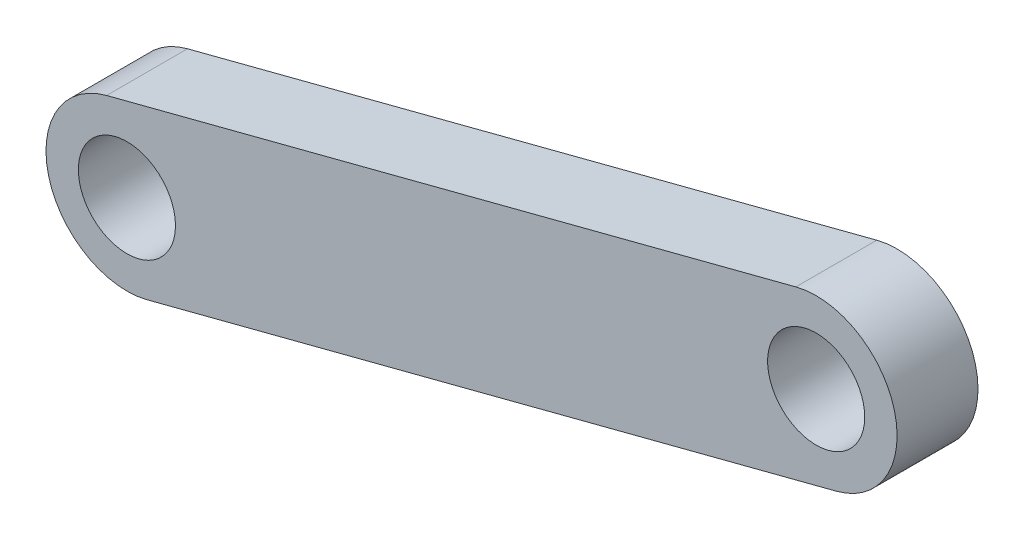
ISO-10303-21;
HEADER;
FILE_DESCRIPTION(('STEP AP214'),'2;1');
FILE_NAME('part.step','',(''),(''),'','','');
FILE_SCHEMA(('AUTOMOTIVE_DESIGN { 1 0 10303 214 1 1 1 1 }'));
ENDSEC;
DATA;
#1=APPLICATION_CONTEXT('core data for automotive mechanical design processes');
#2=APPLICATION_PROTOCOL_DEFINITION('international standard','automotive_design',2000,#1);
#3=PRODUCT_CONTEXT('',#1,'mechanical');
#4=PRODUCT('Part','Part','',(#3));
#5=PRODUCT_RELATED_PRODUCT_CATEGORY('part','',(#4));
#6=PRODUCT_DEFINITION_FORMATION('','',#4);
#7=PRODUCT_DEFINITION_CONTEXT('part definition',#1,'design');
#8=PRODUCT_DEFINITION('design','',#6,#7);
#9=PRODUCT_DEFINITION_SHAPE('','',#8);
#10=(LENGTH_UNIT() NAMED_UNIT(*) SI_UNIT(.MILLI.,.METRE.));
#11=(NAMED_UNIT(*) PLANE_ANGLE_UNIT() SI_UNIT($,.RADIAN.));
#12=(NAMED_UNIT(*) SI_UNIT($,.STERADIAN.) SOLID_ANGLE_UNIT());
#13=UNCERTAINTY_MEASURE_WITH_UNIT(LENGTH_MEASURE(1.E-05),#10,'distance_accuracy_value','');
#14=(GEOMETRIC_REPRESENTATION_CONTEXT(3) GLOBAL_UNCERTAINTY_ASSIGNED_CONTEXT((#13)) GLOBAL_UNIT_ASSIGNED_CONTEXT((#10,
#11,#12)) REPRESENTATION_CONTEXT('',''));
#15=CARTESIAN_POINT('',(0.,0.,0.));
#16=DIRECTION('',(0.,0.,1.));
#17=DIRECTION('',(1.,0.,0.));
#18=AXIS2_PLACEMENT_3D('',#15,#16,#17);
#19=CARTESIAN_POINT('',(-4.11150948786102,15.8443971540323,2.5));
#20=DIRECTION('',(0.251174112768107,-0.967941922366809,0.));
#21=DIRECTION('',(0.967941922366809,0.251174112768107,0.));
#22=AXIS2_PLACEMENT_3D('',#19,#20,#21);
#23=PLANE('',#22);
#24=DIRECTION('',(-0.967941922366809,-0.251174112768107,0.));
#25=VECTOR('',#24,1.);
#26=CARTESIAN_POINT('',(-4.11150948786102,15.8443971540323,0.));
#27=LINE('',#26,#25);
#28=CARTESIAN_POINT('',(-170.179736797107,-27.2491384078721,0.));
#29=VERTEX_POINT('',#28);
#30=CARTESIAN_POINT('',(-191.474459089177,-32.7749688887705,0.));
#31=VERTEX_POINT('',#30);
#32=EDGE_CURVE('E108',#29,#31,#27,.T.);
#33=ORIENTED_EDGE('',*,*,#32,.T.);
#34=DIRECTION('',(0.,0.,-1.));
#35=VECTOR('',#34,1.);
#36=CARTESIAN_POINT('',(-191.474459089177,-32.7749688887705,2.5));
#37=LINE('',#36,#35);
#38=CARTESIAN_POINT('',(-191.474459089177,-32.7749688887705,2.5));
#39=VERTEX_POINT('',#38);
#40=EDGE_CURVE('E11',#39,#31,#37,.T.);
#41=ORIENTED_EDGE('',*,*,#40,.F.);
#42=DIRECTION('',(-0.967941922366809,-0.251174112768107,0.));
#43=VECTOR('',#42,1.);
#44=CARTESIAN_POINT('',(-4.11150948786102,15.8443971540323,2.5));
#45=LINE('',#44,#43);
#46=CARTESIAN_POINT('',(-170.179736797107,-27.2491384078721,2.5));
#47=VERTEX_POINT('',#46);
#48=EDGE_CURVE('E90',#47,#39,#45,.T.);
#49=ORIENTED_EDGE('',*,*,#48,.F.);
#50=DIRECTION('',(0.,0.,-1.));
#51=VECTOR('',#50,1.);
#52=CARTESIAN_POINT('',(-170.179736797107,-27.2491384078721,2.5));
#53=LINE('',#52,#51);
#54=EDGE_CURVE('E104',#47,#29,#53,.T.);
#55=ORIENTED_EDGE('',*,*,#54,.T.);
#56=EDGE_LOOP('',(#33,#41,#49,#55));
#57=FACE_BOUND('',#56,.T.);
#58=ADVANCED_FACE('F37',(#57),#23,.F.);
#59=CARTESIAN_POINT('',(-190.846523807257,-35.1948236946875,2.5));
#60=DIRECTION('',(0.,0.,-1.));
#61=DIRECTION('',(-1.,0.,0.));
#62=AXIS2_PLACEMENT_3D('',#59,#60,#61);
#63=CYLINDRICAL_SURFACE('',#62,2.5);
#64=CARTESIAN_POINT('',(-190.846523807257,-35.1948236946875,0.));
#65=DIRECTION('',(0.,0.,1.));
#66=DIRECTION('',(1.,0.,0.));
#67=AXIS2_PLACEMENT_3D('',#64,#65,#66);
#68=CIRCLE('',#67,2.5);
#69=CARTESIAN_POINT('',(-190.218588525336,-37.6146785006045,0.));
#70=VERTEX_POINT('',#69);
#71=EDGE_CURVE('E94',#31,#70,#68,.T.);
#72=ORIENTED_EDGE('',*,*,#71,.T.);
#73=DIRECTION('',(0.,0.,-1.));
#74=VECTOR('',#73,1.);
#75=CARTESIAN_POINT('',(-190.218588525336,-37.6146785006045,2.5));
#76=LINE('',#75,#74);
#77=CARTESIAN_POINT('',(-190.218588525336,-37.6146785006045,2.5));
#78=VERTEX_POINT('',#77);
#79=EDGE_CURVE('E46',#78,#70,#76,.T.);
#80=ORIENTED_EDGE('',*,*,#79,.F.);
#81=CARTESIAN_POINT('',(-190.846523807257,-35.1948236946875,2.5));
#82=DIRECTION('',(0.,0.,1.));
#83=DIRECTION('',(1.,0.,0.));
#84=AXIS2_PLACEMENT_3D('',#81,#82,#83);
#85=CIRCLE('',#84,2.5);
#86=EDGE_CURVE('E84',#39,#78,#85,.T.);
#87=ORIENTED_EDGE('',*,*,#86,.F.);
#88=ORIENTED_EDGE('',*,*,#40,.T.);
#89=EDGE_LOOP('',(#72,#80,#87,#88));
#90=FACE_BOUND('',#89,.T.);
#91=ADVANCED_FACE('F93',(#90),#63,.T.);
#92=CARTESIAN_POINT('',(-2.85563892401987,11.0046875421963,2.5));
#93=DIRECTION('',(-0.251174112768097,0.967941922366812,0.));
#94=DIRECTION('',(-0.967941922366812,-0.251174112768097,0.));
#95=AXIS2_PLACEMENT_3D('',#92,#93,#94);
#96=PLANE('',#95);
#97=DIRECTION('',(0.967941922366812,0.251174112768097,0.));
#98=VECTOR('',#97,1.);
#99=CARTESIAN_POINT('',(-2.85563892401987,11.0046875421963,0.));
#100=LINE('',#99,#98);
#101=CARTESIAN_POINT('',(-168.923866233267,-32.0888480197064,0.));
#102=VERTEX_POINT('',#101);
#103=EDGE_CURVE('E71',#70,#102,#100,.T.);
#104=ORIENTED_EDGE('',*,*,#103,.T.);
#105=DIRECTION('',(0.,0.,-1.));
#106=VECTOR('',#105,1.);
#107=CARTESIAN_POINT('',(-168.923866233267,-32.0888480197064,2.5));
#108=LINE('',#107,#106);
#109=CARTESIAN_POINT('',(-168.923866233267,-32.0888480197064,2.5));
#110=VERTEX_POINT('',#109);
#111=EDGE_CURVE('E95',#110,#102,#108,.T.);
#112=ORIENTED_EDGE('',*,*,#111,.F.);
#113=DIRECTION('',(0.967941922366812,0.251174112768097,0.));
#114=VECTOR('',#113,1.);
#115=CARTESIAN_POINT('',(-2.85563892401987,11.0046875421963,2.5));
#116=LINE('',#115,#114);
#117=EDGE_CURVE('E88',#78,#110,#116,.T.);
#118=ORIENTED_EDGE('',*,*,#117,.F.);
#119=ORIENTED_EDGE('',*,*,#79,.T.);
#120=EDGE_LOOP('',(#104,#112,#118,#119));
#121=FACE_BOUND('',#120,.T.);
#122=ADVANCED_FACE('F96',(#121),#96,.F.);
#123=CARTESIAN_POINT('',(-169.551801515187,-29.6689932137893,2.5));
#124=DIRECTION('',(0.,0.,-1.));
#125=DIRECTION('',(-1.,0.,0.));
#126=AXIS2_PLACEMENT_3D('',#123,#124,#125);
#127=CYLINDRICAL_SURFACE('',#126,2.50000000000011);
#128=CARTESIAN_POINT('',(-169.551801515187,-29.6689932137893,0.));
#129=DIRECTION('',(0.,0.,1.));
#130=DIRECTION('',(1.,0.,0.));
#131=AXIS2_PLACEMENT_3D('',#128,#129,#130);
#132=CIRCLE('',#131,2.50000000000011);
#133=EDGE_CURVE('E77',#102,#29,#132,.T.);
#134=ORIENTED_EDGE('',*,*,#133,.T.);
#135=ORIENTED_EDGE('',*,*,#54,.F.);
#136=CARTESIAN_POINT('',(-169.551801515187,-29.6689932137893,2.5));
#137=DIRECTION('',(0.,0.,1.));
#138=DIRECTION('',(1.,0.,0.));
#139=AXIS2_PLACEMENT_3D('',#136,#137,#138);
#140=CIRCLE('',#139,2.50000000000011);
#141=EDGE_CURVE('E54',#110,#47,#140,.T.);
#142=ORIENTED_EDGE('',*,*,#141,.F.);
#143=ORIENTED_EDGE('',*,*,#111,.T.);
#144=EDGE_LOOP('',(#134,#135,#142,#143));
#145=FACE_BOUND('',#144,.T.);
#146=ADVANCED_FACE('F119',(#145),#127,.T.);
#147=CARTESIAN_POINT('',(-190.846523807257,-35.1948236946875,2.5));
#148=DIRECTION('',(0.,0.,-1.));
#149=DIRECTION('',(-1.,0.,0.));
#150=AXIS2_PLACEMENT_3D('',#147,#148,#149);
#151=CYLINDRICAL_SURFACE('',#150,1.50000000000003);
#152=CARTESIAN_POINT('',(-190.846523807257,-35.1948236946875,2.5));
#153=DIRECTION('',(0.,0.,1.));
#154=DIRECTION('',(1.,0.,0.));
#155=AXIS2_PLACEMENT_3D('',#152,#153,#154);
#156=CIRCLE('',#155,1.50000000000003);
#157=CARTESIAN_POINT('',(-189.346523807257,-35.1948236946875,2.5));
#158=VERTEX_POINT('',#157);
#159=EDGE_CURVE('E117',#158,#158,#156,.T.);
#160=ORIENTED_EDGE('',*,*,#159,.T.);
#161=EDGE_LOOP('',(#160));
#162=FACE_BOUND('',#161,.T.);
#163=CARTESIAN_POINT('',(-190.846523807257,-35.1948236946875,0.));
#164=DIRECTION('',(0.,0.,1.));
#165=DIRECTION('',(1.,0.,0.));
#166=AXIS2_PLACEMENT_3D('',#163,#164,#165);
#167=CIRCLE('',#166,1.50000000000003);
#168=CARTESIAN_POINT('',(-189.346523807257,-35.1948236946875,0.));
#169=VERTEX_POINT('',#168);
#170=EDGE_CURVE('E105',#169,#169,#167,.T.);
#171=ORIENTED_EDGE('',*,*,#170,.F.);
#172=EDGE_LOOP('',(#171));
#173=FACE_BOUND('',#172,.T.);
#174=ADVANCED_FACE('F39',(#162,#173),#151,.F.);
#175=CARTESIAN_POINT('',(-169.551801515187,-29.6689932137893,2.5));
#176=DIRECTION('',(0.,0.,-1.));
#177=DIRECTION('',(-1.,0.,0.));
#178=AXIS2_PLACEMENT_3D('',#175,#176,#177);
#179=CYLINDRICAL_SURFACE('',#178,1.50001780392866);
#180=CARTESIAN_POINT('',(-169.551801515187,-29.6689932137893,2.5));
#181=DIRECTION('',(0.,0.,1.));
#182=DIRECTION('',(1.,0.,0.));
#183=AXIS2_PLACEMENT_3D('',#180,#181,#182);
#184=CIRCLE('',#183,1.50001780392866);
#185=CARTESIAN_POINT('',(-168.051783711258,-29.6689932137893,2.5));
#186=VERTEX_POINT('',#185);
#187=EDGE_CURVE('E98',#186,#186,#184,.T.);
#188=ORIENTED_EDGE('',*,*,#187,.T.);
#189=EDGE_LOOP('',(#188));
#190=FACE_BOUND('',#189,.T.);
#191=CARTESIAN_POINT('',(-169.551801515187,-29.6689932137893,0.));
#192=DIRECTION('',(0.,0.,1.));
#193=DIRECTION('',(1.,0.,0.));
#194=AXIS2_PLACEMENT_3D('',#191,#192,#193);
#195=CIRCLE('',#194,1.50001780392866);
#196=CARTESIAN_POINT('',(-168.051783711258,-29.6689932137893,0.));
#197=VERTEX_POINT('',#196);
#198=EDGE_CURVE('E114',#197,#197,#195,.T.);
#199=ORIENTED_EDGE('',*,*,#198,.F.);
#200=EDGE_LOOP('',(#199));
#201=FACE_BOUND('',#200,.T.);
#202=ADVANCED_FACE('F132',(#190,#201),#179,.F.);
#203=CARTESIAN_POINT('',(0.,0.,2.5));
#204=DIRECTION('',(0.,0.,1.));
#205=DIRECTION('',(1.,0.,0.));
#206=AXIS2_PLACEMENT_3D('',#203,#204,#205);
#207=PLANE('',#206);
#208=ORIENTED_EDGE('',*,*,#159,.F.);
#209=EDGE_LOOP('',(#208));
#210=FACE_BOUND('',#209,.T.);
#211=ORIENTED_EDGE('',*,*,#48,.T.);
#212=ORIENTED_EDGE('',*,*,#86,.T.);
#213=ORIENTED_EDGE('',*,*,#117,.T.);
#214=ORIENTED_EDGE('',*,*,#141,.T.);
#215=EDGE_LOOP('',(#211,#212,#213,#214));
#216=FACE_BOUND('',#215,.T.);
#217=ORIENTED_EDGE('',*,*,#187,.F.);
#218=EDGE_LOOP('',(#217));
#219=FACE_BOUND('',#218,.T.);
#220=ADVANCED_FACE('F85',(#210,#216,#219),#207,.T.);
#221=CARTESIAN_POINT('',(0.,0.,0.));
#222=DIRECTION('',(0.,0.,1.));
#223=DIRECTION('',(1.,0.,0.));
#224=AXIS2_PLACEMENT_3D('',#221,#222,#223);
#225=PLANE('',#224);
#226=ORIENTED_EDGE('',*,*,#170,.T.);
#227=EDGE_LOOP('',(#226));
#228=FACE_BOUND('',#227,.T.);
#229=ORIENTED_EDGE('',*,*,#32,.F.);
#230=ORIENTED_EDGE('',*,*,#133,.F.);
#231=ORIENTED_EDGE('',*,*,#103,.F.);
#232=ORIENTED_EDGE('',*,*,#71,.F.);
#233=EDGE_LOOP('',(#229,#230,#231,#232));
#234=FACE_BOUND('',#233,.T.);
#235=ORIENTED_EDGE('',*,*,#198,.T.);
#236=EDGE_LOOP('',(#235));
#237=FACE_BOUND('',#236,.T.);
#238=ADVANCED_FACE('F122',(#228,#234,#237),#225,.F.);
#239=CLOSED_SHELL('',(#58,#91,#122,#146,#174,#202,#220,#238));
#240=MANIFOLD_SOLID_BREP('B2',#239);
#241=ADVANCED_BREP_SHAPE_REPRESENTATION('',(#18,#240),#14);
#242=SHAPE_DEFINITION_REPRESENTATION(#9,#241);
ENDSEC;
END-ISO-10303-21;
